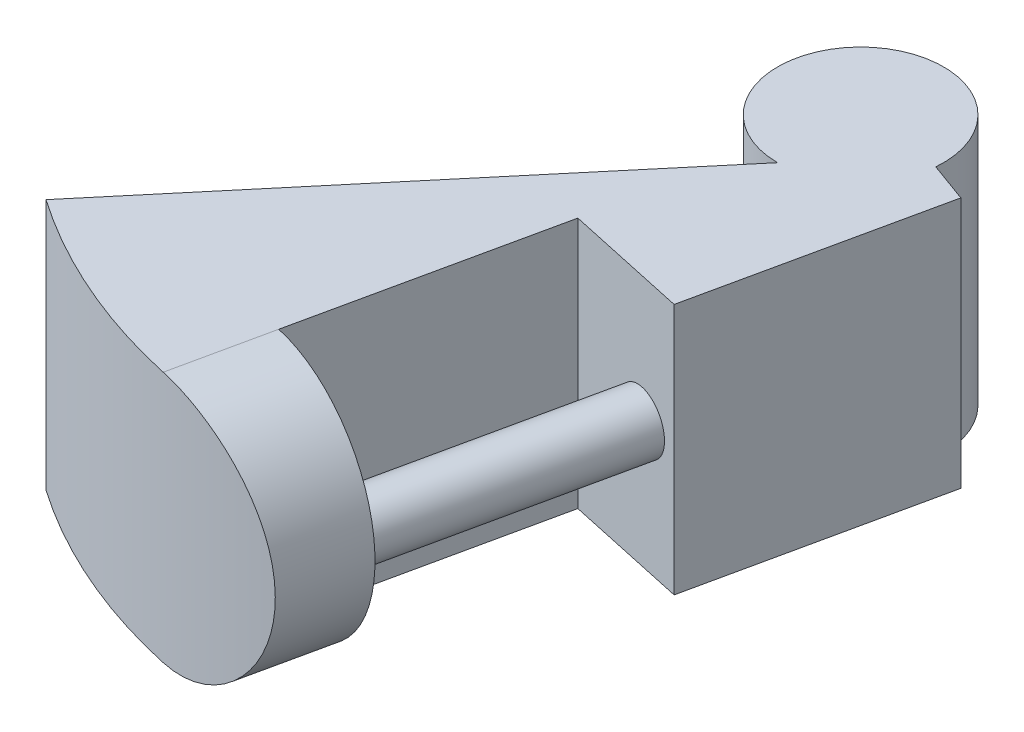
ISO-10303-21;
HEADER;
FILE_DESCRIPTION(('STEP AP214'),'2;1');
FILE_NAME('part.step','',(''),(''),'','','');
FILE_SCHEMA(('AUTOMOTIVE_DESIGN { 1 0 10303 214 1 1 1 1 }'));
ENDSEC;
DATA;
#1=APPLICATION_CONTEXT('core data for automotive mechanical design processes');
#2=APPLICATION_PROTOCOL_DEFINITION('international standard','automotive_design',2000,#1);
#3=PRODUCT_CONTEXT('',#1,'mechanical');
#4=PRODUCT('Part','Part','',(#3));
#5=PRODUCT_RELATED_PRODUCT_CATEGORY('part','',(#4));
#6=PRODUCT_DEFINITION_FORMATION('','',#4);
#7=PRODUCT_DEFINITION_CONTEXT('part definition',#1,'design');
#8=PRODUCT_DEFINITION('design','',#6,#7);
#9=PRODUCT_DEFINITION_SHAPE('','',#8);
#10=(LENGTH_UNIT() NAMED_UNIT(*) SI_UNIT(.MILLI.,.METRE.));
#11=(NAMED_UNIT(*) PLANE_ANGLE_UNIT() SI_UNIT($,.RADIAN.));
#12=(NAMED_UNIT(*) SI_UNIT($,.STERADIAN.) SOLID_ANGLE_UNIT());
#13=UNCERTAINTY_MEASURE_WITH_UNIT(LENGTH_MEASURE(1.E-05),#10,'distance_accuracy_value','');
#14=(GEOMETRIC_REPRESENTATION_CONTEXT(3) GLOBAL_UNCERTAINTY_ASSIGNED_CONTEXT((#13)) GLOBAL_UNIT_ASSIGNED_CONTEXT((#10,
#11,#12)) REPRESENTATION_CONTEXT('',''));
#15=CARTESIAN_POINT('',(0.,0.,0.));
#16=DIRECTION('',(0.,0.,1.));
#17=DIRECTION('',(1.,0.,0.));
#18=AXIS2_PLACEMENT_3D('',#15,#16,#17);
#19=CARTESIAN_POINT('',(3.63949438900451,-15.,18.101128450748));
#20=DIRECTION('',(-0.977326283734099,0.,-0.211738837067021));
#21=DIRECTION('',(-0.211738837067021,0.,0.9773262837341));
#22=AXIS2_PLACEMENT_3D('',#19,#20,#21);
#23=PLANE('',#22);
#24=DIRECTION('',(0.,1.,0.));
#25=VECTOR('',#24,1.);
#26=CARTESIAN_POINT('',(4.23477674134041,-7.5,15.353474325318));
#27=LINE('',#26,#25);
#28=CARTESIAN_POINT('',(4.23477674134041,-15.,15.353474325318));
#29=VERTEX_POINT('',#28);
#30=CARTESIAN_POINT('',(4.23477674134041,0.,15.353474325318));
#31=VERTEX_POINT('',#30);
#32=EDGE_CURVE('E51',#29,#31,#27,.T.);
#33=ORIENTED_EDGE('',*,*,#32,.F.);
#34=DIRECTION('',(-0.21173883706702,0.,0.9773262837341));
#35=VECTOR('',#34,1.);
#36=CARTESIAN_POINT('',(3.63949438900451,-15.,18.101128450748));
#37=LINE('',#36,#35);
#38=CARTESIAN_POINT('',(7.27898877800902,-15.,1.30225690149597));
#39=VERTEX_POINT('',#38);
#40=EDGE_CURVE('E61',#39,#29,#37,.T.);
#41=ORIENTED_EDGE('',*,*,#40,.F.);
#42=DIRECTION('',(0.,1.,0.));
#43=VECTOR('',#42,1.);
#44=CARTESIAN_POINT('',(7.27898877800902,-15.,1.30225690149597));
#45=LINE('',#44,#43);
#46=CARTESIAN_POINT('',(7.27898877800902,0.,1.30225690149597));
#47=VERTEX_POINT('',#46);
#48=EDGE_CURVE('E177',#39,#47,#45,.T.);
#49=ORIENTED_EDGE('',*,*,#48,.T.);
#50=DIRECTION('',(-0.21173883706702,0.,0.9773262837341));
#51=VECTOR('',#50,1.);
#52=CARTESIAN_POINT('',(3.63949438900451,0.,18.101128450748));
#53=LINE('',#52,#51);
#54=EDGE_CURVE('E180',#47,#31,#53,.T.);
#55=ORIENTED_EDGE('',*,*,#54,.T.);
#56=EDGE_LOOP('',(#33,#41,#49,#55));
#57=FACE_BOUND('',#56,.T.);
#58=ADVANCED_FACE('F44',(#57),#23,.F.);
#59=CARTESIAN_POINT('',(-6.31173734590466,-15.,14.975));
#60=DIRECTION('',(0.,-1.,0.));
#61=DIRECTION('',(1.,0.,0.));
#62=AXIS2_PLACEMENT_3D('',#59,#60,#61);
#63=PLANE('',#62);
#64=DIRECTION('',(-0.21173883706702,0.,0.9773262837341));
#65=VECTOR('',#64,1.);
#66=CARTESIAN_POINT('',(-3.69045273900124,-15.,16.5130871727453));
#67=LINE('',#66,#65);
#68=CARTESIAN_POINT('',(-3.09517038666533,-15.,13.7654330473154));
#69=VERTEX_POINT('',#68);
#70=CARTESIAN_POINT('',(-6.27125294267064,-15.,28.4253273033268));
#71=VERTEX_POINT('',#70);
#72=EDGE_CURVE('E130',#69,#71,#67,.T.);
#73=ORIENTED_EDGE('',*,*,#72,.T.);
#74=DIRECTION('',(-0.211738837067021,0.,0.9773262837341));
#75=VECTOR('',#74,1.);
#76=CARTESIAN_POINT('',(-7.32994712800575,-15.,33.3119587219974));
#77=LINE('',#76,#75);
#78=CARTESIAN_POINT('',(-7.49746184258731,-15.,34.0851590273384));
#79=VERTEX_POINT('',#78);
#80=EDGE_CURVE('E196',#71,#79,#77,.T.);
#81=ORIENTED_EDGE('',*,*,#80,.T.);
#82=CARTESIAN_POINT('',(0.,-15.,0.));
#83=DIRECTION('',(0.,-1.,0.));
#84=DIRECTION('',(0.,0.,-1.));
#85=AXIS2_PLACEMENT_3D('',#82,#83,#84);
#86=CIRCLE('',#85,34.9);
#87=CARTESIAN_POINT('',(-19.9024634698184,-15.,28.668832341631));
#88=VERTEX_POINT('',#87);
#89=EDGE_CURVE('E201',#79,#88,#86,.T.);
#90=ORIENTED_EDGE('',*,*,#89,.T.);
#91=DIRECTION('',(-0.64278760968654,0.,0.766044443118978));
#92=VECTOR('',#91,1.);
#93=CARTESIAN_POINT('',(-9.95123173490916,-15.,16.8094161708155));
#94=LINE('',#93,#92);
#95=CARTESIAN_POINT('',(0.,-15.,4.95));
#96=VERTEX_POINT('',#95);
#97=EDGE_CURVE('E208',#96,#88,#94,.T.);
#98=ORIENTED_EDGE('',*,*,#97,.F.);
#99=CARTESIAN_POINT('',(0.,-15.,0.));
#100=DIRECTION('',(0.,-1.,0.));
#101=DIRECTION('',(0.,0.,-1.));
#102=AXIS2_PLACEMENT_3D('',#99,#100,#101);
#103=CIRCLE('',#102,4.95);
#104=CARTESIAN_POINT('',(4.92975722604424,-15.,0.44720654318182));
#105=VERTEX_POINT('',#104);
#106=EDGE_CURVE('E212',#96,#105,#103,.T.);
#107=ORIENTED_EDGE('',*,*,#106,.T.);
#108=DIRECTION('',(-0.939692620785908,0.,-0.342020143325669));
#109=VECTOR('',#108,1.);
#110=CARTESIAN_POINT('',(6.10437300202662,-15.,0.874731722338905));
#111=LINE('',#110,#109);
#112=EDGE_CURVE('E165',#39,#105,#111,.T.);
#113=ORIENTED_EDGE('',*,*,#112,.F.);
#114=ORIENTED_EDGE('',*,*,#40,.T.);
#115=DIRECTION('',(0.9773262837341,0.,0.211738837067021));
#116=VECTOR('',#115,1.);
#117=CARTESIAN_POINT('',(-3.09517038666533,-15.,13.7654330473154));
#118=LINE('',#117,#116);
#119=EDGE_CURVE('E158',#69,#29,#118,.T.);
#120=ORIENTED_EDGE('',*,*,#119,.F.);
#121=EDGE_LOOP('',(#73,#81,#90,#98,#107,#113,#114,#120));
#122=FACE_BOUND('',#121,.T.);
#123=ADVANCED_FACE('F229',(#122),#63,.T.);
#124=CARTESIAN_POINT('',(-9.95123173490916,-15.,16.8094161708155));
#125=DIRECTION('',(-0.766044443118978,0.,-0.64278760968654));
#126=DIRECTION('',(-0.64278760968654,0.,0.766044443118978));
#127=AXIS2_PLACEMENT_3D('',#124,#125,#126);
#128=PLANE('',#127);
#129=DIRECTION('',(-0.64278760968654,0.,0.766044443118978));
#130=VECTOR('',#129,1.);
#131=CARTESIAN_POINT('',(-9.95123173490916,0.,16.8094161708155));
#132=LINE('',#131,#130);
#133=CARTESIAN_POINT('',(0.,0.,4.95));
#134=VERTEX_POINT('',#133);
#135=CARTESIAN_POINT('',(-19.9024634698184,0.,28.668832341631));
#136=VERTEX_POINT('',#135);
#137=EDGE_CURVE('E152',#134,#136,#132,.T.);
#138=ORIENTED_EDGE('',*,*,#137,.F.);
#139=DIRECTION('',(0.,1.,0.));
#140=VECTOR('',#139,1.);
#141=CARTESIAN_POINT('',(0.,-15.,4.95));
#142=LINE('',#141,#140);
#143=EDGE_CURVE('E159',#96,#134,#142,.T.);
#144=ORIENTED_EDGE('',*,*,#143,.F.);
#145=ORIENTED_EDGE('',*,*,#97,.T.);
#146=DIRECTION('',(0.,1.,0.));
#147=VECTOR('',#146,1.);
#148=CARTESIAN_POINT('',(-19.9024634698184,-15.,28.668832341631));
#149=LINE('',#148,#147);
#150=EDGE_CURVE('E394',#88,#136,#149,.T.);
#151=ORIENTED_EDGE('',*,*,#150,.T.);
#152=EDGE_LOOP('',(#138,#144,#145,#151));
#153=FACE_BOUND('',#152,.T.);
#154=ADVANCED_FACE('F269',(#153),#128,.T.);
#155=CARTESIAN_POINT('',(0.,-15.,0.));
#156=DIRECTION('',(0.,1.,0.));
#157=DIRECTION('',(0.,0.,1.));
#158=AXIS2_PLACEMENT_3D('',#155,#156,#157);
#159=CYLINDRICAL_SURFACE('',#158,4.95);
#160=CARTESIAN_POINT('',(0.,0.,0.));
#161=DIRECTION('',(0.,-1.,0.));
#162=DIRECTION('',(0.,0.,-1.));
#163=AXIS2_PLACEMENT_3D('',#160,#161,#162);
#164=CIRCLE('',#163,4.95);
#165=CARTESIAN_POINT('',(4.92975722604424,0.,0.44720654318182));
#166=VERTEX_POINT('',#165);
#167=EDGE_CURVE('E397',#134,#166,#164,.T.);
#168=ORIENTED_EDGE('',*,*,#167,.T.);
#169=DIRECTION('',(0.,1.,0.));
#170=VECTOR('',#169,1.);
#171=CARTESIAN_POINT('',(4.92975722604424,-15.,0.44720654318182));
#172=LINE('',#171,#170);
#173=EDGE_CURVE('E227',#105,#166,#172,.T.);
#174=ORIENTED_EDGE('',*,*,#173,.F.);
#175=ORIENTED_EDGE('',*,*,#106,.F.);
#176=ORIENTED_EDGE('',*,*,#143,.T.);
#177=EDGE_LOOP('',(#168,#174,#175,#176));
#178=FACE_BOUND('',#177,.T.);
#179=ADVANCED_FACE('F266',(#178),#159,.T.);
#180=CARTESIAN_POINT('',(6.10437300202662,-15.,0.874731722338905));
#181=DIRECTION('',(0.342020143325669,0.,-0.939692620785908));
#182=DIRECTION('',(-0.939692620785909,0.,-0.342020143325669));
#183=AXIS2_PLACEMENT_3D('',#180,#181,#182);
#184=PLANE('',#183);
#185=DIRECTION('',(-0.939692620785908,0.,-0.342020143325669));
#186=VECTOR('',#185,1.);
#187=CARTESIAN_POINT('',(6.10437300202662,0.,0.874731722338905));
#188=LINE('',#187,#186);
#189=EDGE_CURVE('E241',#47,#166,#188,.T.);
#190=ORIENTED_EDGE('',*,*,#189,.F.);
#191=ORIENTED_EDGE('',*,*,#48,.F.);
#192=ORIENTED_EDGE('',*,*,#112,.T.);
#193=ORIENTED_EDGE('',*,*,#173,.T.);
#194=EDGE_LOOP('',(#190,#191,#192,#193));
#195=FACE_BOUND('',#194,.T.);
#196=ADVANCED_FACE('F226',(#195),#184,.T.);
#197=CARTESIAN_POINT('',(0.,-15.,0.));
#198=DIRECTION('',(0.,1.,0.));
#199=DIRECTION('',(0.,0.,1.));
#200=AXIS2_PLACEMENT_3D('',#197,#198,#199);
#201=CYLINDRICAL_SURFACE('',#200,34.9);
#202=ORIENTED_EDGE('',*,*,#89,.F.);
#203=CARTESIAN_POINT('',(-7.49746184258731,-15.,34.0851590273384));
#204=CARTESIAN_POINT('',(-7.29402233513361,-15.0000252452654,34.12992705133));
#205=CARTESIAN_POINT('',(-7.09018061215795,-14.9913228305251,34.1728367862558));
#206=CARTESIAN_POINT('',(-6.68320745858617,-14.9566442172016,34.2547437726189));
#207=CARTESIAN_POINT('',(-6.48007594170584,-14.9306701958711,34.2937415164874));
#208=CARTESIAN_POINT('',(-6.07630733495797,-14.8616847410403,34.3675812118925));
#209=CARTESIAN_POINT('',(-5.875666790736,-14.8187004789211,34.4024296763709));
#210=CARTESIAN_POINT('',(-5.47801313741179,-14.7160419812502,34.4679845237055));
#211=CARTESIAN_POINT('',(-5.28100004329807,-14.6563676767522,34.4986908894499));
#212=CARTESIAN_POINT('',(-4.89204566543332,-14.520794843489,34.5559913631418));
#213=CARTESIAN_POINT('',(-4.70010393221776,-14.4448977579727,34.5825858365385));
#214=CARTESIAN_POINT('',(-4.32258018633548,-14.2774158909571,34.6317997440967));
#215=CARTESIAN_POINT('',(-4.1370005502828,-14.185825322035,34.6544177055483));
#216=CARTESIAN_POINT('',(-3.77361870671386,-13.9876550122684,34.6958678235678));
#217=CARTESIAN_POINT('',(-3.59581545048227,-13.8810773007985,34.7147004918561));
#218=CARTESIAN_POINT('',(-3.24920816279805,-13.6536689106464,34.7488557929792));
#219=CARTESIAN_POINT('',(-3.08040447563599,-13.5328376872444,34.7641782916015));
#220=CARTESIAN_POINT('',(-2.7507920203655,-13.2760342128873,34.7918218263753));
#221=CARTESIAN_POINT('',(-2.5901210452994,-13.1398804353624,34.8040997960499));
#222=CARTESIAN_POINT('',(-2.2804186253886,-12.8547117673011,34.8257633613426));
#223=CARTESIAN_POINT('',(-2.13138727417654,-12.7056967733255,34.8351489336952));
#224=CARTESIAN_POINT('',(-1.84600847082583,-12.3957448926019,34.8514374597818));
#225=CARTESIAN_POINT('',(-1.70966599179996,-12.2348033755459,34.8583394431424));
#226=CARTESIAN_POINT('',(-1.45076396166438,-11.9021267034716,34.8700742955514));
#227=CARTESIAN_POINT('',(-1.32820408108926,-11.7303918066163,34.8749072140674));
#228=CARTESIAN_POINT('',(-1.09649193391501,-11.3752391837627,34.8829658264591));
#229=CARTESIAN_POINT('',(-0.987509874368123,-11.1917099072959,34.8861724181196));
#230=CARTESIAN_POINT('',(-0.785555605924831,-10.8161150312336,34.8913041685646));
#231=CARTESIAN_POINT('',(-0.692577437085008,-10.6240526430895,34.893229805153));
#232=CARTESIAN_POINT('',(-0.523449089398359,-10.2328381999433,34.8961768370831));
#233=CARTESIAN_POINT('',(-0.447284392277898,-10.0336924352952,34.8971990148624));
#234=CARTESIAN_POINT('',(-0.312375372622211,-9.62965532110579,34.8986670307123));
#235=CARTESIAN_POINT('',(-0.253626788453013,-9.42476539058624,34.8991130098657));
#236=CARTESIAN_POINT('',(-0.136305015792536,-8.93677253575244,34.8998004013709));
#237=CARTESIAN_POINT('',(-0.0852600633133968,-8.65182533914348,34.8999122148824));
#238=CARTESIAN_POINT('',(-0.0171098383029564,-8.07789364410672,34.9000127181521));
#239=CARTESIAN_POINT('',(-4.4014299069161E-06,-7.78890916523506,34.9000014085064));
#240=CARTESIAN_POINT('',(3.17080241959053E-06,-7.29186902903199,34.899998985308));
#241=CARTESIAN_POINT('',(-0.00886875703900421,-7.08377714434951,34.9000031091111));
#242=CARTESIAN_POINT('',(-0.0442709568626613,-6.66903562603207,34.8999766629751));
#243=CARTESIAN_POINT('',(-0.0708050514665549,-6.46238631439872,34.8999460855245));
#244=CARTESIAN_POINT('',(-0.141321172738757,-6.05194775385076,34.8997315817457));
#245=CARTESIAN_POINT('',(-0.185315164191181,-5.84816056563005,34.8995475501642));
#246=CARTESIAN_POINT('',(-0.290375283035432,-5.44495608936905,34.8988315041051));
#247=CARTESIAN_POINT('',(-0.351447752133156,-5.24554045432568,34.8982993602655));
#248=CARTESIAN_POINT('',(-0.490017645527958,-4.85285564968982,34.8966283638344));
#249=CARTESIAN_POINT('',(-0.567489341604731,-4.65957739131881,34.8954904574169));
#250=CARTESIAN_POINT('',(-0.738295362181207,-4.28008550560692,34.89229447884));
#251=CARTESIAN_POINT('',(-0.831635623713581,-4.09387455442765,34.890236061811));
#252=CARTESIAN_POINT('',(-1.03335202404241,-3.72992627053774,34.8848441682841));
#253=CARTESIAN_POINT('',(-1.14172066316262,-3.55218477035845,34.8815113263191));
#254=CARTESIAN_POINT('',(-1.37273561548284,-3.20616259928684,34.8731839251282));
#255=CARTESIAN_POINT('',(-1.49538843834105,-3.03788629413303,34.8681886063287));
#256=CARTESIAN_POINT('',(-1.75585172813701,-2.70965023367038,34.8560499382226));
#257=CARTESIAN_POINT('',(-1.89385333389548,-2.54984321443278,34.8488769854877));
#258=CARTESIAN_POINT('',(-2.18244656569515,-2.242311701983,34.8319939845186));
#259=CARTESIAN_POINT('',(-2.33303265499372,-2.09458195119197,34.8222850480759));
#260=CARTESIAN_POINT('',(-2.64581884296966,-1.81204653790316,34.7999171417524));
#261=CARTESIAN_POINT('',(-2.80802498538067,-1.67724768743727,34.7872566288894));
#262=CARTESIAN_POINT('',(-3.14273480382663,-1.42163590076794,34.7586164186188));
#263=CARTESIAN_POINT('',(-3.31523458825287,-1.30081772917691,34.7426379699935));
#264=CARTESIAN_POINT('',(-3.67114446989259,-1.07280190214405,34.7068437470525));
#265=CARTESIAN_POINT('',(-3.85464786526725,-0.965755658524849,34.6869905134854));
#266=CARTESIAN_POINT('',(-4.22951027194639,-0.767576212643574,34.6432798395025));
#267=CARTESIAN_POINT('',(-4.42086633919788,-0.676437112735284,34.6194238895735));
#268=CARTESIAN_POINT('',(-4.81001612368319,-0.510749071887636,34.5675026860185));
#269=CARTESIAN_POINT('',(-5.0078076785938,-0.43619462316237,34.5394388350411));
#270=CARTESIAN_POINT('',(-5.40830503868387,-0.30424858315337,34.4789978021301));
#271=CARTESIAN_POINT('',(-5.61100962649403,-0.246852786299335,34.4466216799472));
#272=CARTESIAN_POINT('',(-6.09223649624161,-0.132487335972092,34.3652906848577));
#273=CARTESIAN_POINT('',(-6.37224708105211,-0.0828301969087659,34.3145194120667));
#274=CARTESIAN_POINT('',(-6.79373258303466,-0.0331525594089303,34.2326709390183));
#275=CARTESIAN_POINT('',(-6.93442492496127,-0.020728037992913,34.2044500113368));
#276=CARTESIAN_POINT('',(-7.21594977090968,-0.00415139564816325,34.1461673667943));
#277=CARTESIAN_POINT('',(-7.35678229986953,-1.19381962411345E-06,34.1161052245581));
#278=CARTESIAN_POINT('',(-7.49746184258731,0.,34.0851590273384));
#279=B_SPLINE_CURVE_WITH_KNOTS('',3,(#203,#204,#205,#206,#207,#208,#209,#210,#211,#212,#213,
#214,#215,#216,#217,#218,#219,#220,#221,#222,#223,#224,#225,#226,#227,#228,#229,#230,#231,#232,
#233,#234,#235,#236,#237,#238,#239,#240,#241,#242,#243,#244,#245,#246,#247,#248,#249,#250,#251,
#252,#253,#254,#255,#256,#257,#258,#259,#260,#261,#262,#263,#264,#265,#266,#267,#268,#269,#270,
#271,#272,#273,#274,#275,#276,#277,#278),.UNSPECIFIED.,.F.,.F.,(4,2,2,2,2,2,2,2,2,2,2,2,2,2,2,2,
2,2,2,2,2,2,2,2,2,2,2,2,2,2,2,2,2,2,2,2,2,4),(0.,0.624721183001228,1.24936362879413,
1.87301230090021,2.49666354932548,3.12025933811347,3.74408559268144,4.36782745756464,
4.99159316743016,5.62373480706048,6.25588153130599,6.8882749767104,7.52065330188374,
8.16029660939274,8.7997011921415,9.43855147645172,10.0772453080807,10.9436216119002,
11.8099937205466,12.4341306116192,13.0584026285408,13.6831031825235,14.3080360136372,
14.9319955794703,15.55618910809,16.1800722561814,16.8042408442138,17.4373064348853,
18.0700949500686,18.7032150099811,19.336097210949,19.975431372811,20.6145279927555,
21.2534120498951,21.8921393884969,22.7564942361955,23.1883800428946,23.6203660071656),.UNSPECIFIED.);
#280=CARTESIAN_POINT('',(-7.49746184258731,0.,34.0851590273384));
#281=VERTEX_POINT('',#280);
#282=EDGE_CURVE('E238',#79,#281,#279,.T.);
#283=ORIENTED_EDGE('',*,*,#282,.T.);
#284=CARTESIAN_POINT('',(0.,0.,0.));
#285=DIRECTION('',(0.,-1.,0.));
#286=DIRECTION('',(0.,0.,-1.));
#287=AXIS2_PLACEMENT_3D('',#284,#285,#286);
#288=CIRCLE('',#287,34.9);
#289=EDGE_CURVE('E242',#281,#136,#288,.T.);
#290=ORIENTED_EDGE('',*,*,#289,.T.);
#291=ORIENTED_EDGE('',*,*,#150,.F.);
#292=EDGE_LOOP('',(#202,#283,#290,#291));
#293=FACE_BOUND('',#292,.T.);
#294=ADVANCED_FACE('F260',(#293),#201,.T.);
#295=CARTESIAN_POINT('',(-6.31173734590466,0.,14.975));
#296=DIRECTION('',(0.,-1.,0.));
#297=DIRECTION('',(1.,0.,0.));
#298=AXIS2_PLACEMENT_3D('',#295,#296,#297);
#299=PLANE('',#298);
#300=ORIENTED_EDGE('',*,*,#289,.F.);
#301=DIRECTION('',(-0.211738837067021,0.,0.9773262837341));
#302=VECTOR('',#301,1.);
#303=CARTESIAN_POINT('',(-3.48968509338849,0.,15.5864007901303));
#304=LINE('',#303,#302);
#305=CARTESIAN_POINT('',(-6.27125294267064,0.,28.4253273033268));
#306=VERTEX_POINT('',#305);
#307=EDGE_CURVE('E112',#281,#306,#304,.F.);
#308=ORIENTED_EDGE('',*,*,#307,.T.);
#309=DIRECTION('',(-0.21173883706702,0.,0.9773262837341));
#310=VECTOR('',#309,1.);
#311=CARTESIAN_POINT('',(-3.69045273900124,0.,16.5130871727453));
#312=LINE('',#311,#310);
#313=CARTESIAN_POINT('',(-3.09517038666533,0.,13.7654330473154));
#314=VERTEX_POINT('',#313);
#315=EDGE_CURVE('E105',#314,#306,#312,.T.);
#316=ORIENTED_EDGE('',*,*,#315,.F.);
#317=DIRECTION('',(0.9773262837341,0.,0.211738837067021));
#318=VECTOR('',#317,1.);
#319=CARTESIAN_POINT('',(-3.09517038666533,0.,13.7654330473154));
#320=LINE('',#319,#318);
#321=EDGE_CURVE('E110',#314,#31,#320,.T.);
#322=ORIENTED_EDGE('',*,*,#321,.T.);
#323=ORIENTED_EDGE('',*,*,#54,.F.);
#324=ORIENTED_EDGE('',*,*,#189,.T.);
#325=ORIENTED_EDGE('',*,*,#167,.F.);
#326=ORIENTED_EDGE('',*,*,#137,.T.);
#327=EDGE_LOOP('',(#300,#308,#316,#322,#323,#324,#325,#326));
#328=FACE_BOUND('',#327,.T.);
#329=ADVANCED_FACE('F108',(#328),#299,.F.);
#330=CARTESIAN_POINT('',(-6.27125294267064,-7.5,28.4253273033268));
#331=DIRECTION('',(0.211738837067021,0.,-0.977326283734099));
#332=DIRECTION('',(-0.9773262837341,0.,-0.211738837067021));
#333=AXIS2_PLACEMENT_3D('',#330,#331,#332);
#334=PLANE('',#333);
#335=CARTESIAN_POINT('',(-1.38462152400014,-7.5,29.484021488662));
#336=DIRECTION('',(0.211738837067021,0.,-0.977326283734099));
#337=DIRECTION('',(-0.9773262837341,0.,-0.211738837067021));
#338=AXIS2_PLACEMENT_3D('',#335,#336,#337);
#339=CIRCLE('',#338,1.75);
#340=CARTESIAN_POINT('',(-3.09494252053481,-7.5,29.1134785237947));
#341=VERTEX_POINT('',#340);
#342=EDGE_CURVE('E12',#341,#341,#339,.T.);
#343=ORIENTED_EDGE('',*,*,#342,.F.);
#344=EDGE_LOOP('',(#343));
#345=FACE_BOUND('',#344,.T.);
#346=CARTESIAN_POINT('',(-6.27125294267064,-7.5,28.4253273033268));
#347=DIRECTION('',(0.211738837067021,0.,-0.9773262837341));
#348=DIRECTION('',(-0.9773262837341,0.,-0.211738837067021));
#349=AXIS2_PLACEMENT_3D('',#346,#347,#348);
#350=CIRCLE('',#349,7.5);
#351=EDGE_CURVE('E127',#306,#71,#350,.T.);
#352=ORIENTED_EDGE('',*,*,#351,.T.);
#353=DIRECTION('',(0.,1.,0.));
#354=VECTOR('',#353,1.);
#355=CARTESIAN_POINT('',(-6.27125294267064,-7.5,28.4253273033268));
#356=LINE('',#355,#354);
#357=EDGE_CURVE('E132',#71,#306,#356,.T.);
#358=ORIENTED_EDGE('',*,*,#357,.T.);
#359=EDGE_LOOP('',(#352,#358));
#360=FACE_BOUND('',#359,.T.);
#361=ADVANCED_FACE('F234',(#345,#360),#334,.T.);
#362=CARTESIAN_POINT('',(-3.09517038666533,-7.5,13.7654330473154));
#363=DIRECTION('',(0.211738837067021,0.,-0.977326283734099));
#364=DIRECTION('',(-0.9773262837341,0.,-0.211738837067021));
#365=AXIS2_PLACEMENT_3D('',#362,#363,#364);
#366=PLANE('',#365);
#367=CARTESIAN_POINT('',(1.79146103200517,-7.5,14.8241272326505));
#368=DIRECTION('',(-0.21173883706702,0.,0.9773262837341));
#369=DIRECTION('',(0.9773262837341,0.,0.21173883706702));
#370=AXIS2_PLACEMENT_3D('',#367,#368,#369);
#371=CIRCLE('',#370,1.75);
#372=CARTESIAN_POINT('',(3.50178202853984,-7.5,15.1946701975178));
#373=VERTEX_POINT('',#372);
#374=EDGE_CURVE('E133',#373,#373,#371,.T.);
#375=ORIENTED_EDGE('',*,*,#374,.F.);
#376=EDGE_LOOP('',(#375));
#377=FACE_BOUND('',#376,.T.);
#378=ORIENTED_EDGE('',*,*,#32,.T.);
#379=ORIENTED_EDGE('',*,*,#321,.F.);
#380=DIRECTION('',(0.,1.,0.));
#381=VECTOR('',#380,1.);
#382=CARTESIAN_POINT('',(-3.09517038666533,-7.5,13.7654330473154));
#383=LINE('',#382,#381);
#384=EDGE_CURVE('E124',#69,#314,#383,.T.);
#385=ORIENTED_EDGE('',*,*,#384,.F.);
#386=ORIENTED_EDGE('',*,*,#119,.T.);
#387=EDGE_LOOP('',(#378,#379,#385,#386));
#388=FACE_BOUND('',#387,.T.);
#389=ADVANCED_FACE('F122',(#377,#388),#366,.F.);
#390=CARTESIAN_POINT('',(-3.69045273900124,-7.5,16.5130871727453));
#391=DIRECTION('',(0.9773262837341,0.,0.211738837067021));
#392=DIRECTION('',(0.,1.,0.));
#393=AXIS2_PLACEMENT_3D('',#390,#391,#392);
#394=PLANE('',#393);
#395=ORIENTED_EDGE('',*,*,#357,.F.);
#396=ORIENTED_EDGE('',*,*,#72,.F.);
#397=ORIENTED_EDGE('',*,*,#384,.T.);
#398=ORIENTED_EDGE('',*,*,#315,.T.);
#399=EDGE_LOOP('',(#395,#396,#397,#398));
#400=FACE_BOUND('',#399,.T.);
#401=ADVANCED_FACE('F129',(#400),#394,.T.);
#402=CARTESIAN_POINT('',(-3.69045273900124,-7.5,16.5130871727453));
#403=DIRECTION('',(-0.211738837067021,0.,0.9773262837341));
#404=DIRECTION('',(0.9773262837341,0.,0.211738837067021));
#405=AXIS2_PLACEMENT_3D('',#402,#403,#404);
#406=CYLINDRICAL_SURFACE('',#405,7.5);
#407=ORIENTED_EDGE('',*,*,#282,.F.);
#408=ORIENTED_EDGE('',*,*,#80,.F.);
#409=ORIENTED_EDGE('',*,*,#351,.F.);
#410=ORIENTED_EDGE('',*,*,#307,.F.);
#411=EDGE_LOOP('',(#407,#408,#409,#410));
#412=FACE_BOUND('',#411,.T.);
#413=ADVANCED_FACE('F237',(#412),#406,.T.);
#414=CARTESIAN_POINT('',(1.64906665839507,-7.5,15.4813791846906));
#415=DIRECTION('',(-0.21173883706702,0.,0.9773262837341));
#416=DIRECTION('',(0.9773262837341,0.,0.21173883706702));
#417=AXIS2_PLACEMENT_3D('',#414,#415,#416);
#418=CYLINDRICAL_SURFACE('',#417,1.75);
#419=ORIENTED_EDGE('',*,*,#374,.T.);
#420=EDGE_LOOP('',(#419));
#421=FACE_BOUND('',#420,.T.);
#422=ORIENTED_EDGE('',*,*,#342,.T.);
#423=EDGE_LOOP('',(#422));
#424=FACE_BOUND('',#423,.T.);
#425=ADVANCED_FACE('F338',(#421,#424),#418,.T.);
#426=CLOSED_SHELL('',(#58,#123,#154,#179,#196,#294,#329,#361,#389,#401,#413,#425));
#427=MANIFOLD_SOLID_BREP('B2',#426);
#428=ADVANCED_BREP_SHAPE_REPRESENTATION('',(#18,#427),#14);
#429=SHAPE_DEFINITION_REPRESENTATION(#9,#428);
ENDSEC;
END-ISO-10303-21;
